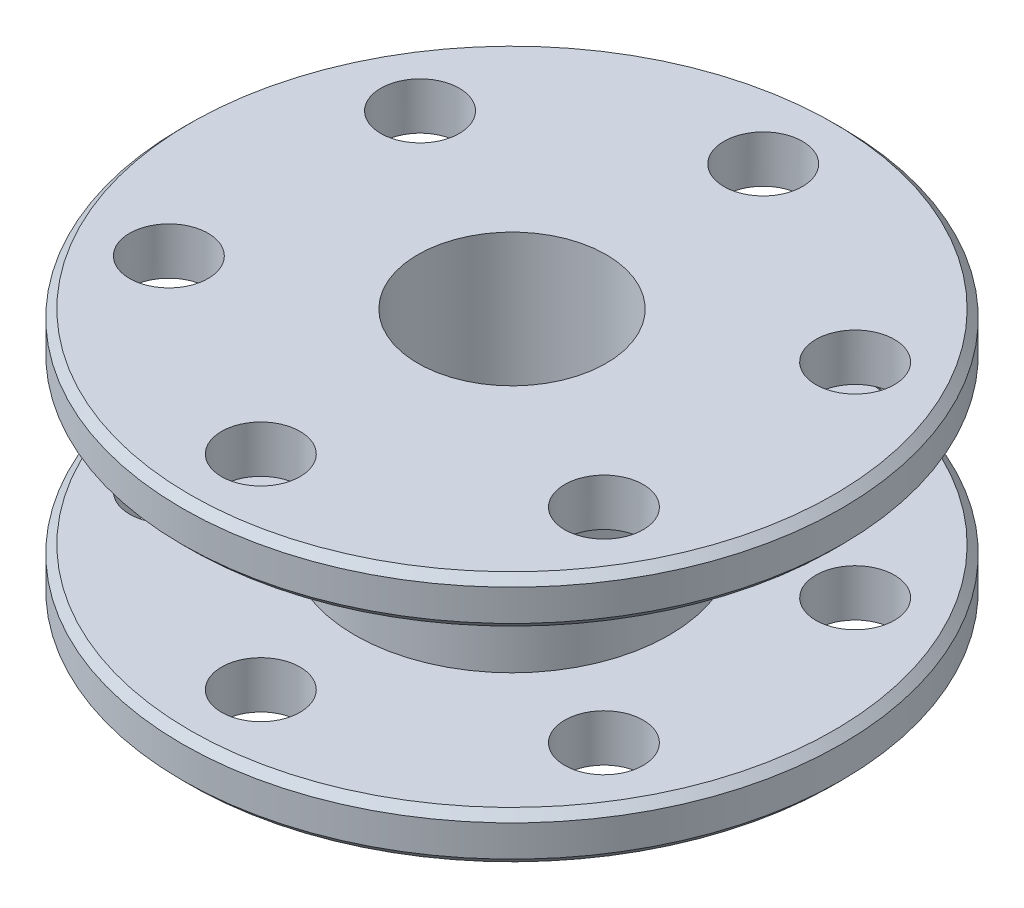
ISO-10303-21;
HEADER;
FILE_DESCRIPTION(('STEP AP214'),'2;1');
FILE_NAME('part.step','',(''),(''),'','','');
FILE_SCHEMA(('AUTOMOTIVE_DESIGN { 1 0 10303 214 1 1 1 1 }'));
ENDSEC;
DATA;
#1=APPLICATION_CONTEXT('core data for automotive mechanical design processes');
#2=APPLICATION_PROTOCOL_DEFINITION('international standard','automotive_design',2000,#1);
#3=PRODUCT_CONTEXT('',#1,'mechanical');
#4=PRODUCT('Part','Part','',(#3));
#5=PRODUCT_RELATED_PRODUCT_CATEGORY('part','',(#4));
#6=PRODUCT_DEFINITION_FORMATION('','',#4);
#7=PRODUCT_DEFINITION_CONTEXT('part definition',#1,'design');
#8=PRODUCT_DEFINITION('design','',#6,#7);
#9=PRODUCT_DEFINITION_SHAPE('','',#8);
#10=(LENGTH_UNIT() NAMED_UNIT(*) SI_UNIT(.MILLI.,.METRE.));
#11=(NAMED_UNIT(*) PLANE_ANGLE_UNIT() SI_UNIT($,.RADIAN.));
#12=(NAMED_UNIT(*) SI_UNIT($,.STERADIAN.) SOLID_ANGLE_UNIT());
#13=UNCERTAINTY_MEASURE_WITH_UNIT(LENGTH_MEASURE(1.E-05),#10,'distance_accuracy_value','');
#14=(GEOMETRIC_REPRESENTATION_CONTEXT(3) GLOBAL_UNCERTAINTY_ASSIGNED_CONTEXT((#13)) GLOBAL_UNIT_ASSIGNED_CONTEXT((#10,
#11,#12)) REPRESENTATION_CONTEXT('',''));
#15=CARTESIAN_POINT('',(0.,0.,0.));
#16=DIRECTION('',(0.,0.,1.));
#17=DIRECTION('',(1.,0.,0.));
#18=AXIS2_PLACEMENT_3D('',#15,#16,#17);
#19=CARTESIAN_POINT('',(21.,0.,0.));
#20=DIRECTION('',(0.,-1.,0.));
#21=DIRECTION('',(0.,0.,-1.));
#22=AXIS2_PLACEMENT_3D('',#19,#20,#21);
#23=PLANE('',#22);
#24=CARTESIAN_POINT('',(0.,0.,-16.));
#25=DIRECTION('',(0.,1.,0.));
#26=DIRECTION('',(0.,0.,1.));
#27=AXIS2_PLACEMENT_3D('',#24,#25,#26);
#28=CIRCLE('',#27,2.5);
#29=CARTESIAN_POINT('',(0.,0.,-13.5));
#30=VERTEX_POINT('',#29);
#31=EDGE_CURVE('E64',#30,#30,#28,.T.);
#32=ORIENTED_EDGE('',*,*,#31,.T.);
#33=EDGE_LOOP('',(#32));
#34=FACE_BOUND('',#33,.T.);
#35=CARTESIAN_POINT('',(-13.8564064605508,0.,-7.9999999999996));
#36=DIRECTION('',(0.,1.,0.));
#37=DIRECTION('',(0.,0.,1.));
#38=AXIS2_PLACEMENT_3D('',#35,#36,#37);
#39=CIRCLE('',#38,2.50000000000052);
#40=CARTESIAN_POINT('',(-13.8564064605508,0.,-5.49999999999908));
#41=VERTEX_POINT('',#40);
#42=EDGE_CURVE('E279',#41,#41,#39,.T.);
#43=ORIENTED_EDGE('',*,*,#42,.T.);
#44=EDGE_LOOP('',(#43));
#45=FACE_BOUND('',#44,.T.);
#46=CARTESIAN_POINT('',(-13.8564064605503,0.,8.0000000000004));
#47=DIRECTION('',(0.,1.,0.));
#48=DIRECTION('',(0.,0.,1.));
#49=AXIS2_PLACEMENT_3D('',#46,#47,#48);
#50=CIRCLE('',#49,2.50000000000091);
#51=CARTESIAN_POINT('',(-13.8564064605503,0.,10.5000000000013));
#52=VERTEX_POINT('',#51);
#53=EDGE_CURVE('E273',#52,#52,#50,.T.);
#54=ORIENTED_EDGE('',*,*,#53,.T.);
#55=EDGE_LOOP('',(#54));
#56=FACE_BOUND('',#55,.T.);
#57=CARTESIAN_POINT('',(9.03616397137021E-13,0.,16.));
#58=DIRECTION('',(0.,1.,0.));
#59=DIRECTION('',(0.,0.,1.));
#60=AXIS2_PLACEMENT_3D('',#57,#58,#59);
#61=CIRCLE('',#60,2.50000000000097);
#62=CARTESIAN_POINT('',(9.03616397137021E-13,0.,18.500000000001));
#63=VERTEX_POINT('',#62);
#64=EDGE_CURVE('E267',#63,#63,#61,.T.);
#65=ORIENTED_EDGE('',*,*,#64,.T.);
#66=EDGE_LOOP('',(#65));
#67=FACE_BOUND('',#66,.T.);
#68=CARTESIAN_POINT('',(13.8564064605517,0.,7.99999999999961));
#69=DIRECTION('',(0.,1.,0.));
#70=DIRECTION('',(0.,0.,1.));
#71=AXIS2_PLACEMENT_3D('',#68,#69,#70);
#72=CIRCLE('',#71,2.50000000000061);
#73=CARTESIAN_POINT('',(13.8564064605517,0.,10.5000000000002));
#74=VERTEX_POINT('',#73);
#75=EDGE_CURVE('E255',#74,#74,#72,.T.);
#76=ORIENTED_EDGE('',*,*,#75,.T.);
#77=EDGE_LOOP('',(#76));
#78=FACE_BOUND('',#77,.T.);
#79=CARTESIAN_POINT('',(13.8564064605512,0.,-8.0000000000004));
#80=DIRECTION('',(0.,1.,0.));
#81=DIRECTION('',(0.,0.,1.));
#82=AXIS2_PLACEMENT_3D('',#79,#80,#81);
#83=CIRCLE('',#82,2.50000000000014);
#84=CARTESIAN_POINT('',(13.8564064605512,0.,-5.50000000000025));
#85=VERTEX_POINT('',#84);
#86=EDGE_CURVE('E254',#85,#85,#83,.T.);
#87=ORIENTED_EDGE('',*,*,#86,.T.);
#88=EDGE_LOOP('',(#87));
#89=FACE_BOUND('',#88,.T.);
#90=CARTESIAN_POINT('',(0.,0.,0.));
#91=DIRECTION('',(0.,-1.,0.));
#92=DIRECTION('',(0.,0.,-1.));
#93=AXIS2_PLACEMENT_3D('',#90,#91,#92);
#94=CIRCLE('',#93,20.5);
#95=CARTESIAN_POINT('',(0.,0.,-20.5));
#96=VERTEX_POINT('',#95);
#97=EDGE_CURVE('E10',#96,#96,#94,.T.);
#98=ORIENTED_EDGE('',*,*,#97,.T.);
#99=EDGE_LOOP('',(#98));
#100=FACE_BOUND('',#99,.T.);
#101=CARTESIAN_POINT('',(0.,0.,0.));
#102=DIRECTION('',(0.,-1.,0.));
#103=DIRECTION('',(0.,0.,-1.));
#104=AXIS2_PLACEMENT_3D('',#101,#102,#103);
#105=CIRCLE('',#104,6.);
#106=CARTESIAN_POINT('',(0.,0.,-6.));
#107=VERTEX_POINT('',#106);
#108=EDGE_CURVE('E112',#107,#107,#105,.T.);
#109=ORIENTED_EDGE('',*,*,#108,.F.);
#110=EDGE_LOOP('',(#109));
#111=FACE_BOUND('',#110,.T.);
#112=ADVANCED_FACE('F39',(#34,#45,#56,#67,#78,#89,#100,#111),#23,.T.);
#113=CARTESIAN_POINT('',(0.,0.,0.));
#114=DIRECTION('',(0.,-1.,0.));
#115=DIRECTION('',(0.,0.,-1.));
#116=AXIS2_PLACEMENT_3D('',#113,#114,#115);
#117=CYLINDRICAL_SURFACE('',#116,6.);
#118=ORIENTED_EDGE('',*,*,#108,.T.);
#119=EDGE_LOOP('',(#118));
#120=FACE_BOUND('',#119,.T.);
#121=CARTESIAN_POINT('',(0.,16.,0.));
#122=DIRECTION('',(0.,-1.,0.));
#123=DIRECTION('',(0.,0.,-1.));
#124=AXIS2_PLACEMENT_3D('',#121,#122,#123);
#125=CIRCLE('',#124,6.);
#126=CARTESIAN_POINT('',(0.,16.,-6.));
#127=VERTEX_POINT('',#126);
#128=EDGE_CURVE('E108',#127,#127,#125,.T.);
#129=ORIENTED_EDGE('',*,*,#128,.F.);
#130=EDGE_LOOP('',(#129));
#131=FACE_BOUND('',#130,.T.);
#132=ADVANCED_FACE('F158',(#120,#131),#117,.F.);
#133=CARTESIAN_POINT('',(6.,16.,0.));
#134=DIRECTION('',(0.,1.,0.));
#135=DIRECTION('',(0.,0.,1.));
#136=AXIS2_PLACEMENT_3D('',#133,#134,#135);
#137=PLANE('',#136);
#138=CARTESIAN_POINT('',(0.,16.,-16.));
#139=DIRECTION('',(0.,1.,0.));
#140=DIRECTION('',(0.,0.,1.));
#141=AXIS2_PLACEMENT_3D('',#138,#139,#140);
#142=CIRCLE('',#141,2.5);
#143=CARTESIAN_POINT('',(0.,16.,-13.5));
#144=VERTEX_POINT('',#143);
#145=EDGE_CURVE('E228',#144,#144,#142,.T.);
#146=ORIENTED_EDGE('',*,*,#145,.F.);
#147=EDGE_LOOP('',(#146));
#148=FACE_BOUND('',#147,.T.);
#149=CARTESIAN_POINT('',(-13.8564064605508,16.,-7.9999999999996));
#150=DIRECTION('',(0.,1.,0.));
#151=DIRECTION('',(0.,0.,1.));
#152=AXIS2_PLACEMENT_3D('',#149,#150,#151);
#153=CIRCLE('',#152,2.50000000000052);
#154=CARTESIAN_POINT('',(-13.8564064605508,16.,-5.49999999999908));
#155=VERTEX_POINT('',#154);
#156=EDGE_CURVE('E232',#155,#155,#153,.T.);
#157=ORIENTED_EDGE('',*,*,#156,.F.);
#158=EDGE_LOOP('',(#157));
#159=FACE_BOUND('',#158,.T.);
#160=CARTESIAN_POINT('',(-13.8564064605503,16.,8.0000000000004));
#161=DIRECTION('',(0.,1.,0.));
#162=DIRECTION('',(0.,0.,1.));
#163=AXIS2_PLACEMENT_3D('',#160,#161,#162);
#164=CIRCLE('',#163,2.50000000000091);
#165=CARTESIAN_POINT('',(-13.8564064605503,16.,10.5000000000013));
#166=VERTEX_POINT('',#165);
#167=EDGE_CURVE('E236',#166,#166,#164,.T.);
#168=ORIENTED_EDGE('',*,*,#167,.F.);
#169=EDGE_LOOP('',(#168));
#170=FACE_BOUND('',#169,.T.);
#171=CARTESIAN_POINT('',(9.03616397137021E-13,16.,16.));
#172=DIRECTION('',(0.,1.,0.));
#173=DIRECTION('',(0.,0.,1.));
#174=AXIS2_PLACEMENT_3D('',#171,#172,#173);
#175=CIRCLE('',#174,2.50000000000097);
#176=CARTESIAN_POINT('',(9.03616397137021E-13,16.,18.500000000001));
#177=VERTEX_POINT('',#176);
#178=EDGE_CURVE('E240',#177,#177,#175,.T.);
#179=ORIENTED_EDGE('',*,*,#178,.F.);
#180=EDGE_LOOP('',(#179));
#181=FACE_BOUND('',#180,.T.);
#182=CARTESIAN_POINT('',(13.8564064605517,16.,7.99999999999961));
#183=DIRECTION('',(0.,1.,0.));
#184=DIRECTION('',(0.,0.,1.));
#185=AXIS2_PLACEMENT_3D('',#182,#183,#184);
#186=CIRCLE('',#185,2.50000000000061);
#187=CARTESIAN_POINT('',(13.8564064605517,16.,10.5000000000002));
#188=VERTEX_POINT('',#187);
#189=EDGE_CURVE('E244',#188,#188,#186,.T.);
#190=ORIENTED_EDGE('',*,*,#189,.F.);
#191=EDGE_LOOP('',(#190));
#192=FACE_BOUND('',#191,.T.);
#193=CARTESIAN_POINT('',(13.8564064605512,16.,-8.0000000000004));
#194=DIRECTION('',(0.,1.,0.));
#195=DIRECTION('',(0.,0.,1.));
#196=AXIS2_PLACEMENT_3D('',#193,#194,#195);
#197=CIRCLE('',#196,2.50000000000014);
#198=CARTESIAN_POINT('',(13.8564064605512,16.,-5.50000000000025));
#199=VERTEX_POINT('',#198);
#200=EDGE_CURVE('E248',#199,#199,#197,.T.);
#201=ORIENTED_EDGE('',*,*,#200,.F.);
#202=EDGE_LOOP('',(#201));
#203=FACE_BOUND('',#202,.T.);
#204=CARTESIAN_POINT('',(0.,16.,0.));
#205=DIRECTION('',(0.,1.,0.));
#206=DIRECTION('',(0.,0.,1.));
#207=AXIS2_PLACEMENT_3D('',#204,#205,#206);
#208=CIRCLE('',#207,20.5);
#209=CARTESIAN_POINT('',(0.,16.,20.5));
#210=VERTEX_POINT('',#209);
#211=EDGE_CURVE('E124',#210,#210,#208,.T.);
#212=ORIENTED_EDGE('',*,*,#211,.T.);
#213=EDGE_LOOP('',(#212));
#214=FACE_BOUND('',#213,.T.);
#215=ORIENTED_EDGE('',*,*,#128,.T.);
#216=EDGE_LOOP('',(#215));
#217=FACE_BOUND('',#216,.T.);
#218=ADVANCED_FACE('F164',(#148,#159,#170,#181,#192,#203,#214,#217),#137,.T.);
#219=CARTESIAN_POINT('',(0.,0.,0.));
#220=DIRECTION('',(0.,-1.,0.));
#221=DIRECTION('',(0.,0.,-1.));
#222=AXIS2_PLACEMENT_3D('',#219,#220,#221);
#223=CYLINDRICAL_SURFACE('',#222,21.);
#224=CARTESIAN_POINT('',(0.,15.5,0.));
#225=DIRECTION('',(0.,1.,0.));
#226=DIRECTION('',(0.,0.,1.));
#227=AXIS2_PLACEMENT_3D('',#224,#225,#226);
#228=CIRCLE('',#227,21.);
#229=CARTESIAN_POINT('',(0.,15.5,21.));
#230=VERTEX_POINT('',#229);
#231=EDGE_CURVE('E120',#230,#230,#228,.F.);
#232=ORIENTED_EDGE('',*,*,#231,.T.);
#233=EDGE_LOOP('',(#232));
#234=FACE_BOUND('',#233,.T.);
#235=CARTESIAN_POINT('',(0.,13.5,0.));
#236=DIRECTION('',(0.,-1.,0.));
#237=DIRECTION('',(0.,0.,-1.));
#238=AXIS2_PLACEMENT_3D('',#235,#236,#237);
#239=CIRCLE('',#238,21.);
#240=CARTESIAN_POINT('',(0.,13.5,-21.));
#241=VERTEX_POINT('',#240);
#242=EDGE_CURVE('E116',#241,#241,#239,.F.);
#243=ORIENTED_EDGE('',*,*,#242,.T.);
#244=EDGE_LOOP('',(#243));
#245=FACE_BOUND('',#244,.T.);
#246=ADVANCED_FACE('F192',(#234,#245),#223,.T.);
#247=CARTESIAN_POINT('',(21.,13.,0.));
#248=DIRECTION('',(0.,-1.,0.));
#249=DIRECTION('',(0.,0.,-1.));
#250=AXIS2_PLACEMENT_3D('',#247,#248,#249);
#251=PLANE('',#250);
#252=CARTESIAN_POINT('',(0.,13.,-16.));
#253=DIRECTION('',(0.,-1.,0.));
#254=DIRECTION('',(0.,0.,-1.));
#255=AXIS2_PLACEMENT_3D('',#252,#253,#254);
#256=CIRCLE('',#255,2.5);
#257=CARTESIAN_POINT('',(0.,13.,-18.5));
#258=VERTEX_POINT('',#257);
#259=EDGE_CURVE('E96',#258,#258,#256,.T.);
#260=ORIENTED_EDGE('',*,*,#259,.F.);
#261=EDGE_LOOP('',(#260));
#262=FACE_BOUND('',#261,.T.);
#263=CARTESIAN_POINT('',(-13.8564064605508,13.,-7.9999999999996));
#264=DIRECTION('',(0.,-1.,0.));
#265=DIRECTION('',(0.,0.,-1.));
#266=AXIS2_PLACEMENT_3D('',#263,#264,#265);
#267=CIRCLE('',#266,2.50000000000052);
#268=CARTESIAN_POINT('',(-13.8564064605508,13.,-10.5000000000001));
#269=VERTEX_POINT('',#268);
#270=EDGE_CURVE('E82',#269,#269,#267,.T.);
#271=ORIENTED_EDGE('',*,*,#270,.F.);
#272=EDGE_LOOP('',(#271));
#273=FACE_BOUND('',#272,.T.);
#274=CARTESIAN_POINT('',(-13.8564064605503,13.,8.0000000000004));
#275=DIRECTION('',(0.,-1.,0.));
#276=DIRECTION('',(0.,0.,-1.));
#277=AXIS2_PLACEMENT_3D('',#274,#275,#276);
#278=CIRCLE('',#277,2.50000000000091);
#279=CARTESIAN_POINT('',(-13.8564064605503,13.,5.49999999999949));
#280=VERTEX_POINT('',#279);
#281=EDGE_CURVE('E78',#280,#280,#278,.T.);
#282=ORIENTED_EDGE('',*,*,#281,.F.);
#283=EDGE_LOOP('',(#282));
#284=FACE_BOUND('',#283,.T.);
#285=CARTESIAN_POINT('',(9.03616397137021E-13,13.,16.));
#286=DIRECTION('',(0.,-1.,0.));
#287=DIRECTION('',(0.,0.,-1.));
#288=AXIS2_PLACEMENT_3D('',#285,#286,#287);
#289=CIRCLE('',#288,2.50000000000097);
#290=CARTESIAN_POINT('',(9.03616397137021E-13,13.,13.499999999999));
#291=VERTEX_POINT('',#290);
#292=EDGE_CURVE('E74',#291,#291,#289,.T.);
#293=ORIENTED_EDGE('',*,*,#292,.F.);
#294=EDGE_LOOP('',(#293));
#295=FACE_BOUND('',#294,.T.);
#296=CARTESIAN_POINT('',(13.8564064605517,13.,7.99999999999961));
#297=DIRECTION('',(0.,-1.,0.));
#298=DIRECTION('',(0.,0.,-1.));
#299=AXIS2_PLACEMENT_3D('',#296,#297,#298);
#300=CIRCLE('',#299,2.50000000000061);
#301=CARTESIAN_POINT('',(13.8564064605517,13.,5.499999999999));
#302=VERTEX_POINT('',#301);
#303=EDGE_CURVE('E69',#302,#302,#300,.T.);
#304=ORIENTED_EDGE('',*,*,#303,.F.);
#305=EDGE_LOOP('',(#304));
#306=FACE_BOUND('',#305,.T.);
#307=CARTESIAN_POINT('',(13.8564064605512,13.,-8.0000000000004));
#308=DIRECTION('',(0.,-1.,0.));
#309=DIRECTION('',(0.,0.,-1.));
#310=AXIS2_PLACEMENT_3D('',#307,#308,#309);
#311=CIRCLE('',#310,2.50000000000014);
#312=CARTESIAN_POINT('',(13.8564064605512,13.,-10.5000000000005));
#313=VERTEX_POINT('',#312);
#314=EDGE_CURVE('E63',#313,#313,#311,.T.);
#315=ORIENTED_EDGE('',*,*,#314,.F.);
#316=EDGE_LOOP('',(#315));
#317=FACE_BOUND('',#316,.T.);
#318=CARTESIAN_POINT('',(0.,13.,0.));
#319=DIRECTION('',(0.,-1.,0.));
#320=DIRECTION('',(0.,0.,-1.));
#321=AXIS2_PLACEMENT_3D('',#318,#319,#320);
#322=CIRCLE('',#321,20.5);
#323=CARTESIAN_POINT('',(0.,13.,-20.5));
#324=VERTEX_POINT('',#323);
#325=EDGE_CURVE('E128',#324,#324,#322,.T.);
#326=ORIENTED_EDGE('',*,*,#325,.T.);
#327=EDGE_LOOP('',(#326));
#328=FACE_BOUND('',#327,.T.);
#329=CARTESIAN_POINT('',(0.,13.,0.));
#330=DIRECTION('',(0.,-1.,0.));
#331=DIRECTION('',(0.,0.,-1.));
#332=AXIS2_PLACEMENT_3D('',#329,#330,#331);
#333=CIRCLE('',#332,10.);
#334=CARTESIAN_POINT('',(0.,13.,-10.));
#335=VERTEX_POINT('',#334);
#336=EDGE_CURVE('E104',#335,#335,#333,.T.);
#337=ORIENTED_EDGE('',*,*,#336,.F.);
#338=EDGE_LOOP('',(#337));
#339=FACE_BOUND('',#338,.T.);
#340=ADVANCED_FACE('F195',(#262,#273,#284,#295,#306,#317,#328,#339),#251,.T.);
#341=CARTESIAN_POINT('',(0.,0.,0.));
#342=DIRECTION('',(0.,-1.,0.));
#343=DIRECTION('',(0.,0.,-1.));
#344=AXIS2_PLACEMENT_3D('',#341,#342,#343);
#345=CYLINDRICAL_SURFACE('',#344,10.);
#346=ORIENTED_EDGE('',*,*,#336,.T.);
#347=EDGE_LOOP('',(#346));
#348=FACE_BOUND('',#347,.T.);
#349=CARTESIAN_POINT('',(0.,3.,0.));
#350=DIRECTION('',(0.,-1.,0.));
#351=DIRECTION('',(0.,0.,-1.));
#352=AXIS2_PLACEMENT_3D('',#349,#350,#351);
#353=CIRCLE('',#352,10.);
#354=CARTESIAN_POINT('',(0.,3.,-10.));
#355=VERTEX_POINT('',#354);
#356=EDGE_CURVE('E100',#355,#355,#353,.T.);
#357=ORIENTED_EDGE('',*,*,#356,.F.);
#358=EDGE_LOOP('',(#357));
#359=FACE_BOUND('',#358,.T.);
#360=ADVANCED_FACE('F203',(#348,#359),#345,.T.);
#361=CARTESIAN_POINT('',(10.,3.,0.));
#362=DIRECTION('',(0.,1.,0.));
#363=DIRECTION('',(0.,0.,1.));
#364=AXIS2_PLACEMENT_3D('',#361,#362,#363);
#365=PLANE('',#364);
#366=CARTESIAN_POINT('',(0.,3.,-16.));
#367=DIRECTION('',(0.,1.,0.));
#368=DIRECTION('',(0.,0.,1.));
#369=AXIS2_PLACEMENT_3D('',#366,#367,#368);
#370=CIRCLE('',#369,2.5);
#371=CARTESIAN_POINT('',(0.,3.,-13.5));
#372=VERTEX_POINT('',#371);
#373=EDGE_CURVE('E44',#372,#372,#370,.T.);
#374=ORIENTED_EDGE('',*,*,#373,.F.);
#375=EDGE_LOOP('',(#374));
#376=FACE_BOUND('',#375,.T.);
#377=CARTESIAN_POINT('',(-13.8564064605508,3.,-7.9999999999996));
#378=DIRECTION('',(0.,1.,0.));
#379=DIRECTION('',(0.,0.,1.));
#380=AXIS2_PLACEMENT_3D('',#377,#378,#379);
#381=CIRCLE('',#380,2.50000000000052);
#382=CARTESIAN_POINT('',(-13.8564064605508,3.,-5.49999999999908));
#383=VERTEX_POINT('',#382);
#384=EDGE_CURVE('E79',#383,#383,#381,.T.);
#385=ORIENTED_EDGE('',*,*,#384,.F.);
#386=EDGE_LOOP('',(#385));
#387=FACE_BOUND('',#386,.T.);
#388=CARTESIAN_POINT('',(-13.8564064605503,3.,8.0000000000004));
#389=DIRECTION('',(0.,1.,0.));
#390=DIRECTION('',(0.,0.,1.));
#391=AXIS2_PLACEMENT_3D('',#388,#389,#390);
#392=CIRCLE('',#391,2.50000000000091);
#393=CARTESIAN_POINT('',(-13.8564064605503,3.,10.5000000000013));
#394=VERTEX_POINT('',#393);
#395=EDGE_CURVE('E75',#394,#394,#392,.T.);
#396=ORIENTED_EDGE('',*,*,#395,.F.);
#397=EDGE_LOOP('',(#396));
#398=FACE_BOUND('',#397,.T.);
#399=CARTESIAN_POINT('',(9.03616397137021E-13,3.,16.));
#400=DIRECTION('',(0.,1.,0.));
#401=DIRECTION('',(0.,0.,1.));
#402=AXIS2_PLACEMENT_3D('',#399,#400,#401);
#403=CIRCLE('',#402,2.50000000000097);
#404=CARTESIAN_POINT('',(9.03616397137021E-13,3.,18.500000000001));
#405=VERTEX_POINT('',#404);
#406=EDGE_CURVE('E70',#405,#405,#403,.T.);
#407=ORIENTED_EDGE('',*,*,#406,.F.);
#408=EDGE_LOOP('',(#407));
#409=FACE_BOUND('',#408,.T.);
#410=CARTESIAN_POINT('',(13.8564064605517,3.,7.99999999999961));
#411=DIRECTION('',(0.,1.,0.));
#412=DIRECTION('',(0.,0.,1.));
#413=AXIS2_PLACEMENT_3D('',#410,#411,#412);
#414=CIRCLE('',#413,2.50000000000061);
#415=CARTESIAN_POINT('',(13.8564064605517,3.,10.5000000000002));
#416=VERTEX_POINT('',#415);
#417=EDGE_CURVE('E65',#416,#416,#414,.T.);
#418=ORIENTED_EDGE('',*,*,#417,.F.);
#419=EDGE_LOOP('',(#418));
#420=FACE_BOUND('',#419,.T.);
#421=CARTESIAN_POINT('',(13.8564064605512,3.,-8.0000000000004));
#422=DIRECTION('',(0.,1.,0.));
#423=DIRECTION('',(0.,0.,1.));
#424=AXIS2_PLACEMENT_3D('',#421,#422,#423);
#425=CIRCLE('',#424,2.50000000000014);
#426=CARTESIAN_POINT('',(13.8564064605512,3.,-5.50000000000025));
#427=VERTEX_POINT('',#426);
#428=EDGE_CURVE('E59',#427,#427,#425,.T.);
#429=ORIENTED_EDGE('',*,*,#428,.F.);
#430=EDGE_LOOP('',(#429));
#431=FACE_BOUND('',#430,.T.);
#432=CARTESIAN_POINT('',(0.,3.,0.));
#433=DIRECTION('',(0.,1.,0.));
#434=DIRECTION('',(0.,0.,1.));
#435=AXIS2_PLACEMENT_3D('',#432,#433,#434);
#436=CIRCLE('',#435,20.5);
#437=CARTESIAN_POINT('',(0.,3.,20.5));
#438=VERTEX_POINT('',#437);
#439=EDGE_CURVE('E49',#438,#438,#436,.T.);
#440=ORIENTED_EDGE('',*,*,#439,.T.);
#441=EDGE_LOOP('',(#440));
#442=FACE_BOUND('',#441,.T.);
#443=ORIENTED_EDGE('',*,*,#356,.T.);
#444=EDGE_LOOP('',(#443));
#445=FACE_BOUND('',#444,.T.);
#446=ADVANCED_FACE('F186',(#376,#387,#398,#409,#420,#431,#442,#445),#365,.T.);
#447=CARTESIAN_POINT('',(0.,0.,0.));
#448=DIRECTION('',(0.,-1.,0.));
#449=DIRECTION('',(0.,0.,-1.));
#450=AXIS2_PLACEMENT_3D('',#447,#448,#449);
#451=CYLINDRICAL_SURFACE('',#450,21.);
#452=CARTESIAN_POINT('',(0.,2.50000000000001,0.));
#453=DIRECTION('',(0.,1.,0.));
#454=DIRECTION('',(0.,0.,1.));
#455=AXIS2_PLACEMENT_3D('',#452,#453,#454);
#456=CIRCLE('',#455,21.);
#457=CARTESIAN_POINT('',(0.,2.50000000000001,21.));
#458=VERTEX_POINT('',#457);
#459=EDGE_CURVE('E55',#458,#458,#456,.F.);
#460=ORIENTED_EDGE('',*,*,#459,.T.);
#461=EDGE_LOOP('',(#460));
#462=FACE_BOUND('',#461,.T.);
#463=CARTESIAN_POINT('',(0.,0.50000000000001,0.));
#464=DIRECTION('',(0.,-1.,0.));
#465=DIRECTION('',(0.,0.,-1.));
#466=AXIS2_PLACEMENT_3D('',#463,#464,#465);
#467=CIRCLE('',#466,21.);
#468=CARTESIAN_POINT('',(0.,0.50000000000001,-21.));
#469=VERTEX_POINT('',#468);
#470=EDGE_CURVE('E132',#469,#469,#467,.F.);
#471=ORIENTED_EDGE('',*,*,#470,.T.);
#472=EDGE_LOOP('',(#471));
#473=FACE_BOUND('',#472,.T.);
#474=ADVANCED_FACE('F139',(#462,#473),#451,.T.);
#475=CARTESIAN_POINT('',(0.,15.5,0.));
#476=DIRECTION('',(0.,-1.,0.));
#477=DIRECTION('',(0.,0.,-1.));
#478=AXIS2_PLACEMENT_3D('',#475,#476,#477);
#479=CONICAL_SURFACE('',#478,21.,0.785398163397459);
#480=ORIENTED_EDGE('',*,*,#211,.F.);
#481=EDGE_LOOP('',(#480));
#482=FACE_BOUND('',#481,.T.);
#483=ORIENTED_EDGE('',*,*,#231,.F.);
#484=EDGE_LOOP('',(#483));
#485=FACE_BOUND('',#484,.T.);
#486=ADVANCED_FACE('F152',(#482,#485),#479,.T.);
#487=CARTESIAN_POINT('',(0.,13.,0.));
#488=DIRECTION('',(0.,1.,0.));
#489=DIRECTION('',(0.,0.,1.));
#490=AXIS2_PLACEMENT_3D('',#487,#488,#489);
#491=CONICAL_SURFACE('',#490,20.5,0.785398163397438);
#492=ORIENTED_EDGE('',*,*,#242,.F.);
#493=EDGE_LOOP('',(#492));
#494=FACE_BOUND('',#493,.T.);
#495=ORIENTED_EDGE('',*,*,#325,.F.);
#496=EDGE_LOOP('',(#495));
#497=FACE_BOUND('',#496,.T.);
#498=ADVANCED_FACE('F144',(#494,#497),#491,.T.);
#499=CARTESIAN_POINT('',(0.,2.50000000000001,0.));
#500=DIRECTION('',(0.,-1.,0.));
#501=DIRECTION('',(0.,0.,-1.));
#502=AXIS2_PLACEMENT_3D('',#499,#500,#501);
#503=CONICAL_SURFACE('',#502,21.,0.785398163397448);
#504=ORIENTED_EDGE('',*,*,#439,.F.);
#505=EDGE_LOOP('',(#504));
#506=FACE_BOUND('',#505,.T.);
#507=ORIENTED_EDGE('',*,*,#459,.F.);
#508=EDGE_LOOP('',(#507));
#509=FACE_BOUND('',#508,.T.);
#510=ADVANCED_FACE('F142',(#506,#509),#503,.T.);
#511=CARTESIAN_POINT('',(0.,0.,0.));
#512=DIRECTION('',(0.,1.,0.));
#513=DIRECTION('',(0.,0.,1.));
#514=AXIS2_PLACEMENT_3D('',#511,#512,#513);
#515=CONICAL_SURFACE('',#514,20.5,0.785398163397441);
#516=ORIENTED_EDGE('',*,*,#470,.F.);
#517=EDGE_LOOP('',(#516));
#518=FACE_BOUND('',#517,.T.);
#519=ORIENTED_EDGE('',*,*,#97,.F.);
#520=EDGE_LOOP('',(#519));
#521=FACE_BOUND('',#520,.T.);
#522=ADVANCED_FACE('F42',(#518,#521),#515,.T.);
#523=CARTESIAN_POINT('',(13.8564064605512,0.,-8.0000000000004));
#524=DIRECTION('',(0.,1.,0.));
#525=DIRECTION('',(0.,0.,1.));
#526=AXIS2_PLACEMENT_3D('',#523,#524,#525);
#527=CYLINDRICAL_SURFACE('',#526,2.50000000000014);
#528=ORIENTED_EDGE('',*,*,#428,.T.);
#529=EDGE_LOOP('',(#528));
#530=FACE_BOUND('',#529,.T.);
#531=ORIENTED_EDGE('',*,*,#86,.F.);
#532=EDGE_LOOP('',(#531));
#533=FACE_BOUND('',#532,.T.);
#534=ADVANCED_FACE('F150',(#530,#533),#527,.F.);
#535=CARTESIAN_POINT('',(13.8564064605517,0.,7.99999999999961));
#536=DIRECTION('',(0.,1.,0.));
#537=DIRECTION('',(0.,0.,1.));
#538=AXIS2_PLACEMENT_3D('',#535,#536,#537);
#539=CYLINDRICAL_SURFACE('',#538,2.50000000000061);
#540=ORIENTED_EDGE('',*,*,#417,.T.);
#541=EDGE_LOOP('',(#540));
#542=FACE_BOUND('',#541,.T.);
#543=ORIENTED_EDGE('',*,*,#75,.F.);
#544=EDGE_LOOP('',(#543));
#545=FACE_BOUND('',#544,.T.);
#546=ADVANCED_FACE('F302',(#542,#545),#539,.F.);
#547=CARTESIAN_POINT('',(9.03616397137021E-13,0.,16.));
#548=DIRECTION('',(0.,1.,0.));
#549=DIRECTION('',(0.,0.,1.));
#550=AXIS2_PLACEMENT_3D('',#547,#548,#549);
#551=CYLINDRICAL_SURFACE('',#550,2.50000000000097);
#552=ORIENTED_EDGE('',*,*,#406,.T.);
#553=EDGE_LOOP('',(#552));
#554=FACE_BOUND('',#553,.T.);
#555=ORIENTED_EDGE('',*,*,#64,.F.);
#556=EDGE_LOOP('',(#555));
#557=FACE_BOUND('',#556,.T.);
#558=ADVANCED_FACE('F313',(#554,#557),#551,.F.);
#559=CARTESIAN_POINT('',(-13.8564064605503,0.,8.0000000000004));
#560=DIRECTION('',(0.,1.,0.));
#561=DIRECTION('',(0.,0.,1.));
#562=AXIS2_PLACEMENT_3D('',#559,#560,#561);
#563=CYLINDRICAL_SURFACE('',#562,2.50000000000091);
#564=ORIENTED_EDGE('',*,*,#395,.T.);
#565=EDGE_LOOP('',(#564));
#566=FACE_BOUND('',#565,.T.);
#567=ORIENTED_EDGE('',*,*,#53,.F.);
#568=EDGE_LOOP('',(#567));
#569=FACE_BOUND('',#568,.T.);
#570=ADVANCED_FACE('F326',(#566,#569),#563,.F.);
#571=CARTESIAN_POINT('',(-13.8564064605508,0.,-7.9999999999996));
#572=DIRECTION('',(0.,1.,0.));
#573=DIRECTION('',(0.,0.,1.));
#574=AXIS2_PLACEMENT_3D('',#571,#572,#573);
#575=CYLINDRICAL_SURFACE('',#574,2.50000000000052);
#576=ORIENTED_EDGE('',*,*,#384,.T.);
#577=EDGE_LOOP('',(#576));
#578=FACE_BOUND('',#577,.T.);
#579=ORIENTED_EDGE('',*,*,#42,.F.);
#580=EDGE_LOOP('',(#579));
#581=FACE_BOUND('',#580,.T.);
#582=ADVANCED_FACE('F303',(#578,#581),#575,.F.);
#583=CARTESIAN_POINT('',(0.,0.,-16.));
#584=DIRECTION('',(0.,1.,0.));
#585=DIRECTION('',(0.,0.,1.));
#586=AXIS2_PLACEMENT_3D('',#583,#584,#585);
#587=CYLINDRICAL_SURFACE('',#586,2.5);
#588=ORIENTED_EDGE('',*,*,#373,.T.);
#589=EDGE_LOOP('',(#588));
#590=FACE_BOUND('',#589,.T.);
#591=ORIENTED_EDGE('',*,*,#31,.F.);
#592=EDGE_LOOP('',(#591));
#593=FACE_BOUND('',#592,.T.);
#594=ADVANCED_FACE('F294',(#590,#593),#587,.F.);
#595=ORIENTED_EDGE('',*,*,#314,.T.);
#596=EDGE_LOOP('',(#595));
#597=FACE_BOUND('',#596,.T.);
#598=ORIENTED_EDGE('',*,*,#200,.T.);
#599=EDGE_LOOP('',(#598));
#600=FACE_BOUND('',#599,.T.);
#601=ADVANCED_FACE('F292',(#597,#600),#527,.F.);
#602=ORIENTED_EDGE('',*,*,#303,.T.);
#603=EDGE_LOOP('',(#602));
#604=FACE_BOUND('',#603,.T.);
#605=ORIENTED_EDGE('',*,*,#189,.T.);
#606=EDGE_LOOP('',(#605));
#607=FACE_BOUND('',#606,.T.);
#608=ADVANCED_FACE('F286',(#604,#607),#539,.F.);
#609=ORIENTED_EDGE('',*,*,#292,.T.);
#610=EDGE_LOOP('',(#609));
#611=FACE_BOUND('',#610,.T.);
#612=ORIENTED_EDGE('',*,*,#178,.T.);
#613=EDGE_LOOP('',(#612));
#614=FACE_BOUND('',#613,.T.);
#615=ADVANCED_FACE('F300',(#611,#614),#551,.F.);
#616=ORIENTED_EDGE('',*,*,#281,.T.);
#617=EDGE_LOOP('',(#616));
#618=FACE_BOUND('',#617,.T.);
#619=ORIENTED_EDGE('',*,*,#167,.T.);
#620=EDGE_LOOP('',(#619));
#621=FACE_BOUND('',#620,.T.);
#622=ADVANCED_FACE('F332',(#618,#621),#563,.F.);
#623=ORIENTED_EDGE('',*,*,#270,.T.);
#624=EDGE_LOOP('',(#623));
#625=FACE_BOUND('',#624,.T.);
#626=ORIENTED_EDGE('',*,*,#156,.T.);
#627=EDGE_LOOP('',(#626));
#628=FACE_BOUND('',#627,.T.);
#629=ADVANCED_FACE('F336',(#625,#628),#575,.F.);
#630=ORIENTED_EDGE('',*,*,#259,.T.);
#631=EDGE_LOOP('',(#630));
#632=FACE_BOUND('',#631,.T.);
#633=ORIENTED_EDGE('',*,*,#145,.T.);
#634=EDGE_LOOP('',(#633));
#635=FACE_BOUND('',#634,.T.);
#636=ADVANCED_FACE('F306',(#632,#635),#587,.F.);
#637=CLOSED_SHELL('',(#112,#132,#218,#246,#340,#360,#446,#474,#486,#498,#510,#522,#534,#546,
#558,#570,#582,#594,#601,#608,#615,#622,#629,#636));
#638=MANIFOLD_SOLID_BREP('B2',#637);
#639=ADVANCED_BREP_SHAPE_REPRESENTATION('',(#18,#638),#14);
#640=SHAPE_DEFINITION_REPRESENTATION(#9,#639);
ENDSEC;
END-ISO-10303-21;
